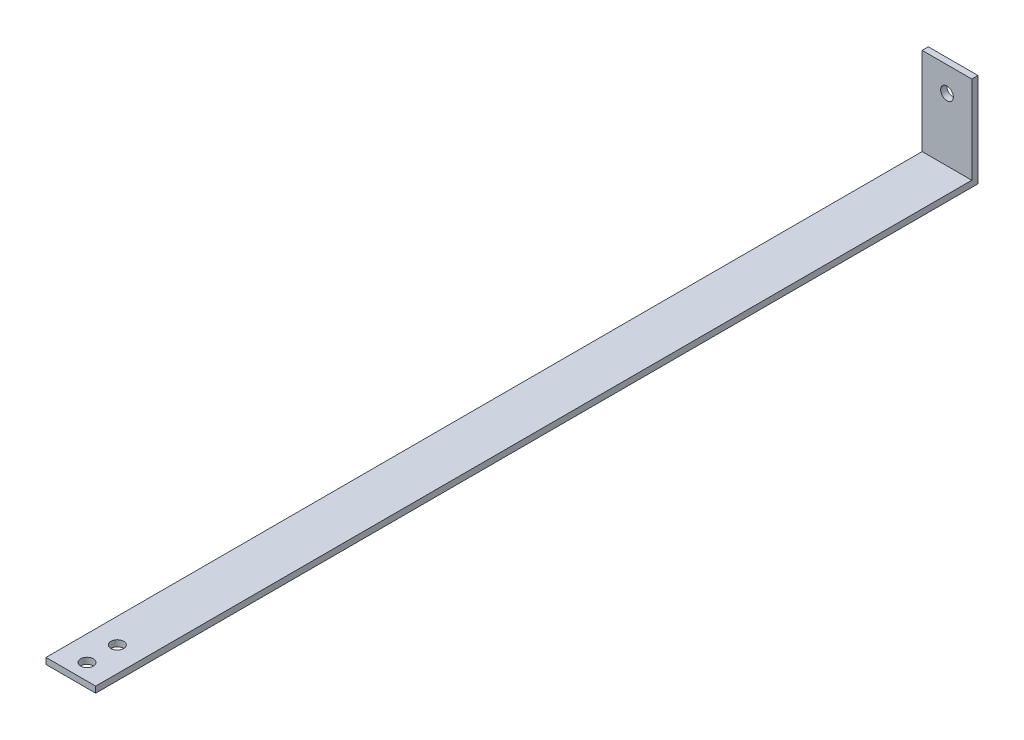
ISO-10303-21;
HEADER;
FILE_DESCRIPTION(('STEP AP214'),'2;1');
FILE_NAME('part.step','',(''),(''),'','','');
FILE_SCHEMA(('AUTOMOTIVE_DESIGN { 1 0 10303 214 1 1 1 1 }'));
ENDSEC;
DATA;
#1=APPLICATION_CONTEXT('core data for automotive mechanical design processes');
#2=APPLICATION_PROTOCOL_DEFINITION('international standard','automotive_design',2000,#1);
#3=PRODUCT_CONTEXT('',#1,'mechanical');
#4=PRODUCT('Part','Part','',(#3));
#5=PRODUCT_RELATED_PRODUCT_CATEGORY('part','',(#4));
#6=PRODUCT_DEFINITION_FORMATION('','',#4);
#7=PRODUCT_DEFINITION_CONTEXT('part definition',#1,'design');
#8=PRODUCT_DEFINITION('design','',#6,#7);
#9=PRODUCT_DEFINITION_SHAPE('','',#8);
#10=(LENGTH_UNIT() NAMED_UNIT(*) SI_UNIT(.MILLI.,.METRE.));
#11=(NAMED_UNIT(*) PLANE_ANGLE_UNIT() SI_UNIT($,.RADIAN.));
#12=(NAMED_UNIT(*) SI_UNIT($,.STERADIAN.) SOLID_ANGLE_UNIT());
#13=UNCERTAINTY_MEASURE_WITH_UNIT(LENGTH_MEASURE(1.E-05),#10,'distance_accuracy_value','');
#14=(GEOMETRIC_REPRESENTATION_CONTEXT(3) GLOBAL_UNCERTAINTY_ASSIGNED_CONTEXT((#13)) GLOBAL_UNIT_ASSIGNED_CONTEXT((#10,
#11,#12)) REPRESENTATION_CONTEXT('',''));
#15=CARTESIAN_POINT('',(0.,0.,0.));
#16=DIRECTION('',(0.,0.,1.));
#17=DIRECTION('',(1.,0.,0.));
#18=AXIS2_PLACEMENT_3D('',#15,#16,#17);
#19=CARTESIAN_POINT('',(50.8,6.3099999999999,6.31000000000004));
#20=DIRECTION('',(0.,0.,-1.));
#21=DIRECTION('',(0.,1.,0.));
#22=AXIS2_PLACEMENT_3D('',#19,#20,#21);
#23=PLANE('',#22);
#24=CARTESIAN_POINT('',(25.4,70.53,6.31000000000003));
#25=DIRECTION('',(0.,0.,-1.));
#26=DIRECTION('',(0.,1.,0.));
#27=AXIS2_PLACEMENT_3D('',#24,#25,#26);
#28=CIRCLE('',#27,6.5);
#29=CARTESIAN_POINT('',(25.4,77.03,6.31000000000003));
#30=VERTEX_POINT('',#29);
#31=EDGE_CURVE('E161',#30,#30,#28,.T.);
#32=ORIENTED_EDGE('',*,*,#31,.T.);
#33=EDGE_LOOP('',(#32));
#34=FACE_BOUND('',#33,.T.);
#35=DIRECTION('',(0.,-1.,0.));
#36=VECTOR('',#35,1.);
#37=CARTESIAN_POINT('',(0.,6.3099999999999,6.31000000000004));
#38=LINE('',#37,#36);
#39=CARTESIAN_POINT('',(0.,95.93,6.31000000000003));
#40=VERTEX_POINT('',#39);
#41=CARTESIAN_POINT('',(0.,6.3099999999999,6.31000000000004));
#42=VERTEX_POINT('',#41);
#43=EDGE_CURVE('E117',#40,#42,#38,.T.);
#44=ORIENTED_EDGE('',*,*,#43,.T.);
#45=DIRECTION('',(-1.,0.,0.));
#46=VECTOR('',#45,1.);
#47=CARTESIAN_POINT('',(50.8,6.3099999999999,6.31000000000004));
#48=LINE('',#47,#46);
#49=CARTESIAN_POINT('',(50.8,6.3099999999999,6.31000000000004));
#50=VERTEX_POINT('',#49);
#51=EDGE_CURVE('E11',#50,#42,#48,.T.);
#52=ORIENTED_EDGE('',*,*,#51,.F.);
#53=DIRECTION('',(0.,-1.,0.));
#54=VECTOR('',#53,1.);
#55=CARTESIAN_POINT('',(50.8,6.3099999999999,6.31000000000004));
#56=LINE('',#55,#54);
#57=CARTESIAN_POINT('',(50.8,95.93,6.31000000000003));
#58=VERTEX_POINT('',#57);
#59=EDGE_CURVE('E128',#58,#50,#56,.T.);
#60=ORIENTED_EDGE('',*,*,#59,.F.);
#61=DIRECTION('',(-1.,0.,0.));
#62=VECTOR('',#61,1.);
#63=CARTESIAN_POINT('',(50.8,95.93,6.31000000000003));
#64=LINE('',#63,#62);
#65=EDGE_CURVE('E113',#58,#40,#64,.T.);
#66=ORIENTED_EDGE('',*,*,#65,.T.);
#67=EDGE_LOOP('',(#44,#52,#60,#66));
#68=FACE_BOUND('',#67,.T.);
#69=ADVANCED_FACE('F33',(#34,#68),#23,.F.);
#70=CARTESIAN_POINT('',(50.8,6.30999999999989,902.2));
#71=DIRECTION('',(0.,-1.,0.));
#72=DIRECTION('',(0.,0.,-1.));
#73=AXIS2_PLACEMENT_3D('',#70,#71,#72);
#74=PLANE('',#73);
#75=CARTESIAN_POINT('',(25.4000000000054,6.30999999999989,854.699999999994));
#76=DIRECTION('',(0.,-1.,0.));
#77=DIRECTION('',(0.,0.,-1.));
#78=AXIS2_PLACEMENT_3D('',#75,#76,#77);
#79=CIRCLE('',#78,6.5);
#80=CARTESIAN_POINT('',(25.4000000000054,6.30999999999989,848.199999999994));
#81=VERTEX_POINT('',#80);
#82=EDGE_CURVE('E167',#81,#81,#79,.T.);
#83=ORIENTED_EDGE('',*,*,#82,.T.);
#84=EDGE_LOOP('',(#83));
#85=FACE_BOUND('',#84,.T.);
#86=CARTESIAN_POINT('',(25.4000000000051,6.30999999999989,885.699999999994));
#87=DIRECTION('',(0.,-1.,0.));
#88=DIRECTION('',(0.,0.,-1.));
#89=AXIS2_PLACEMENT_3D('',#86,#87,#88);
#90=CIRCLE('',#89,6.5);
#91=CARTESIAN_POINT('',(25.4000000000051,6.30999999999989,879.199999999994));
#92=VERTEX_POINT('',#91);
#93=EDGE_CURVE('E121',#92,#92,#90,.T.);
#94=ORIENTED_EDGE('',*,*,#93,.T.);
#95=EDGE_LOOP('',(#94));
#96=FACE_BOUND('',#95,.T.);
#97=DIRECTION('',(0.,0.,1.));
#98=VECTOR('',#97,1.);
#99=CARTESIAN_POINT('',(0.,6.30999999999989,902.2));
#100=LINE('',#99,#98);
#101=CARTESIAN_POINT('',(0.,6.30999999999989,902.2));
#102=VERTEX_POINT('',#101);
#103=EDGE_CURVE('E120',#42,#102,#100,.T.);
#104=ORIENTED_EDGE('',*,*,#103,.T.);
#105=DIRECTION('',(-1.,0.,0.));
#106=VECTOR('',#105,1.);
#107=CARTESIAN_POINT('',(50.8,6.30999999999989,902.2));
#108=LINE('',#107,#106);
#109=CARTESIAN_POINT('',(50.8,6.30999999999989,902.2));
#110=VERTEX_POINT('',#109);
#111=EDGE_CURVE('E41',#110,#102,#108,.T.);
#112=ORIENTED_EDGE('',*,*,#111,.F.);
#113=DIRECTION('',(0.,0.,1.));
#114=VECTOR('',#113,1.);
#115=CARTESIAN_POINT('',(50.8,6.30999999999989,902.2));
#116=LINE('',#115,#114);
#117=EDGE_CURVE('E86',#50,#110,#116,.T.);
#118=ORIENTED_EDGE('',*,*,#117,.F.);
#119=ORIENTED_EDGE('',*,*,#51,.T.);
#120=EDGE_LOOP('',(#104,#112,#118,#119));
#121=FACE_BOUND('',#120,.T.);
#122=ADVANCED_FACE('F153',(#85,#96,#121),#74,.F.);
#123=CARTESIAN_POINT('',(50.8,-1.10487634219074E-13,902.2));
#124=DIRECTION('',(0.,0.,-1.));
#125=DIRECTION('',(-1.,0.,0.));
#126=AXIS2_PLACEMENT_3D('',#123,#124,#125);
#127=PLANE('',#126);
#128=DIRECTION('',(0.,-1.,0.));
#129=VECTOR('',#128,1.);
#130=CARTESIAN_POINT('',(0.,-1.10487634219074E-13,902.2));
#131=LINE('',#130,#129);
#132=CARTESIAN_POINT('',(0.,-1.10487634219074E-13,902.2));
#133=VERTEX_POINT('',#132);
#134=EDGE_CURVE('E123',#102,#133,#131,.T.);
#135=ORIENTED_EDGE('',*,*,#134,.T.);
#136=DIRECTION('',(-1.,0.,0.));
#137=VECTOR('',#136,1.);
#138=CARTESIAN_POINT('',(50.8,-1.10487634219074E-13,902.2));
#139=LINE('',#138,#137);
#140=CARTESIAN_POINT('',(50.8,-1.10487634219074E-13,902.2));
#141=VERTEX_POINT('',#140);
#142=EDGE_CURVE('E108',#141,#133,#139,.T.);
#143=ORIENTED_EDGE('',*,*,#142,.F.);
#144=DIRECTION('',(0.,-1.,0.));
#145=VECTOR('',#144,1.);
#146=CARTESIAN_POINT('',(50.8,-1.10487634219074E-13,902.2));
#147=LINE('',#146,#145);
#148=EDGE_CURVE('E99',#110,#141,#147,.T.);
#149=ORIENTED_EDGE('',*,*,#148,.F.);
#150=ORIENTED_EDGE('',*,*,#111,.T.);
#151=EDGE_LOOP('',(#135,#143,#149,#150));
#152=FACE_BOUND('',#151,.T.);
#153=ADVANCED_FACE('F134',(#152),#127,.F.);
#154=CARTESIAN_POINT('',(50.8,0.,0.));
#155=DIRECTION('',(0.,1.,0.));
#156=DIRECTION('',(0.,0.,1.));
#157=AXIS2_PLACEMENT_3D('',#154,#155,#156);
#158=PLANE('',#157);
#159=CARTESIAN_POINT('',(25.4000000000054,-1.04670561923124E-13,854.699999999994));
#160=DIRECTION('',(0.,-1.,0.));
#161=DIRECTION('',(0.,0.,-1.));
#162=AXIS2_PLACEMENT_3D('',#159,#160,#161);
#163=CIRCLE('',#162,6.5);
#164=CARTESIAN_POINT('',(25.4000000000054,-1.03874541503678E-13,848.199999999994));
#165=VERTEX_POINT('',#164);
#166=EDGE_CURVE('E163',#165,#165,#163,.T.);
#167=ORIENTED_EDGE('',*,*,#166,.F.);
#168=EDGE_LOOP('',(#167));
#169=FACE_BOUND('',#168,.T.);
#170=CARTESIAN_POINT('',(25.4000000000051,-1.0846696700048E-13,885.699999999994));
#171=DIRECTION('',(0.,-1.,0.));
#172=DIRECTION('',(0.,0.,-1.));
#173=AXIS2_PLACEMENT_3D('',#170,#171,#172);
#174=CIRCLE('',#173,6.5);
#175=CARTESIAN_POINT('',(25.4000000000051,-1.07670946581035E-13,879.199999999994));
#176=VERTEX_POINT('',#175);
#177=EDGE_CURVE('E174',#176,#176,#174,.T.);
#178=ORIENTED_EDGE('',*,*,#177,.F.);
#179=EDGE_LOOP('',(#178));
#180=FACE_BOUND('',#179,.T.);
#181=DIRECTION('',(0.,0.,-1.));
#182=VECTOR('',#181,1.);
#183=CARTESIAN_POINT('',(0.,0.,0.));
#184=LINE('',#183,#182);
#185=CARTESIAN_POINT('',(0.,0.,0.));
#186=VERTEX_POINT('',#185);
#187=EDGE_CURVE('E107',#133,#186,#184,.T.);
#188=ORIENTED_EDGE('',*,*,#187,.T.);
#189=DIRECTION('',(-1.,0.,0.));
#190=VECTOR('',#189,1.);
#191=CARTESIAN_POINT('',(50.8,0.,0.));
#192=LINE('',#191,#190);
#193=CARTESIAN_POINT('',(50.8,0.,0.));
#194=VERTEX_POINT('',#193);
#195=EDGE_CURVE('E104',#194,#186,#192,.T.);
#196=ORIENTED_EDGE('',*,*,#195,.F.);
#197=DIRECTION('',(0.,0.,-1.));
#198=VECTOR('',#197,1.);
#199=CARTESIAN_POINT('',(50.8,0.,0.));
#200=LINE('',#199,#198);
#201=EDGE_CURVE('E93',#141,#194,#200,.T.);
#202=ORIENTED_EDGE('',*,*,#201,.F.);
#203=ORIENTED_EDGE('',*,*,#142,.T.);
#204=EDGE_LOOP('',(#188,#196,#202,#203));
#205=FACE_BOUND('',#204,.T.);
#206=ADVANCED_FACE('F105',(#169,#180,#205),#158,.F.);
#207=CARTESIAN_POINT('',(50.8,95.93,0.));
#208=DIRECTION('',(0.,0.,1.));
#209=DIRECTION('',(0.,-1.,0.));
#210=AXIS2_PLACEMENT_3D('',#207,#208,#209);
#211=PLANE('',#210);
#212=CARTESIAN_POINT('',(25.4,70.53,0.));
#213=DIRECTION('',(0.,0.,-1.));
#214=DIRECTION('',(0.,1.,0.));
#215=AXIS2_PLACEMENT_3D('',#212,#213,#214);
#216=CIRCLE('',#215,6.5);
#217=CARTESIAN_POINT('',(25.4,77.03,0.));
#218=VERTEX_POINT('',#217);
#219=EDGE_CURVE('E164',#218,#218,#216,.T.);
#220=ORIENTED_EDGE('',*,*,#219,.F.);
#221=EDGE_LOOP('',(#220));
#222=FACE_BOUND('',#221,.T.);
#223=DIRECTION('',(0.,1.,0.));
#224=VECTOR('',#223,1.);
#225=CARTESIAN_POINT('',(0.,95.93,0.));
#226=LINE('',#225,#224);
#227=CARTESIAN_POINT('',(0.,95.93,0.));
#228=VERTEX_POINT('',#227);
#229=EDGE_CURVE('E72',#186,#228,#226,.T.);
#230=ORIENTED_EDGE('',*,*,#229,.T.);
#231=DIRECTION('',(-1.,0.,0.));
#232=VECTOR('',#231,1.);
#233=CARTESIAN_POINT('',(50.8,95.93,0.));
#234=LINE('',#233,#232);
#235=CARTESIAN_POINT('',(50.8,95.93,0.));
#236=VERTEX_POINT('',#235);
#237=EDGE_CURVE('E109',#236,#228,#234,.T.);
#238=ORIENTED_EDGE('',*,*,#237,.F.);
#239=DIRECTION('',(0.,1.,0.));
#240=VECTOR('',#239,1.);
#241=CARTESIAN_POINT('',(50.8,95.93,0.));
#242=LINE('',#241,#240);
#243=EDGE_CURVE('E97',#194,#236,#242,.T.);
#244=ORIENTED_EDGE('',*,*,#243,.F.);
#245=ORIENTED_EDGE('',*,*,#195,.T.);
#246=EDGE_LOOP('',(#230,#238,#244,#245));
#247=FACE_BOUND('',#246,.T.);
#248=ADVANCED_FACE('F111',(#222,#247),#211,.F.);
#249=CARTESIAN_POINT('',(50.8,95.93,6.31000000000003));
#250=DIRECTION('',(0.,-1.,0.));
#251=DIRECTION('',(0.,0.,-1.));
#252=AXIS2_PLACEMENT_3D('',#249,#250,#251);
#253=PLANE('',#252);
#254=DIRECTION('',(0.,0.,1.));
#255=VECTOR('',#254,1.);
#256=CARTESIAN_POINT('',(0.,95.93,6.31000000000003));
#257=LINE('',#256,#255);
#258=EDGE_CURVE('E78',#228,#40,#257,.T.);
#259=ORIENTED_EDGE('',*,*,#258,.T.);
#260=ORIENTED_EDGE('',*,*,#65,.F.);
#261=DIRECTION('',(0.,0.,1.));
#262=VECTOR('',#261,1.);
#263=CARTESIAN_POINT('',(50.8,95.93,6.31000000000003));
#264=LINE('',#263,#262);
#265=EDGE_CURVE('E49',#236,#58,#264,.T.);
#266=ORIENTED_EDGE('',*,*,#265,.F.);
#267=ORIENTED_EDGE('',*,*,#237,.T.);
#268=EDGE_LOOP('',(#259,#260,#266,#267));
#269=FACE_BOUND('',#268,.T.);
#270=ADVANCED_FACE('F141',(#269),#253,.F.);
#271=CARTESIAN_POINT('',(50.8,0.,0.));
#272=DIRECTION('',(-1.,0.,0.));
#273=DIRECTION('',(0.,0.,1.));
#274=AXIS2_PLACEMENT_3D('',#271,#272,#273);
#275=PLANE('',#274);
#276=ORIENTED_EDGE('',*,*,#59,.T.);
#277=ORIENTED_EDGE('',*,*,#117,.T.);
#278=ORIENTED_EDGE('',*,*,#148,.T.);
#279=ORIENTED_EDGE('',*,*,#201,.T.);
#280=ORIENTED_EDGE('',*,*,#243,.T.);
#281=ORIENTED_EDGE('',*,*,#265,.T.);
#282=EDGE_LOOP('',(#276,#277,#278,#279,#280,#281));
#283=FACE_BOUND('',#282,.T.);
#284=ADVANCED_FACE('F95',(#283),#275,.F.);
#285=CARTESIAN_POINT('',(0.,0.,0.));
#286=DIRECTION('',(-1.,0.,0.));
#287=DIRECTION('',(0.,0.,1.));
#288=AXIS2_PLACEMENT_3D('',#285,#286,#287);
#289=PLANE('',#288);
#290=ORIENTED_EDGE('',*,*,#43,.F.);
#291=ORIENTED_EDGE('',*,*,#258,.F.);
#292=ORIENTED_EDGE('',*,*,#229,.F.);
#293=ORIENTED_EDGE('',*,*,#187,.F.);
#294=ORIENTED_EDGE('',*,*,#134,.F.);
#295=ORIENTED_EDGE('',*,*,#103,.F.);
#296=EDGE_LOOP('',(#290,#291,#292,#293,#294,#295));
#297=FACE_BOUND('',#296,.T.);
#298=ADVANCED_FACE('F137',(#297),#289,.T.);
#299=CARTESIAN_POINT('',(25.4000000000051,9.99999999999989,885.699999999994));
#300=DIRECTION('',(0.,-1.,0.));
#301=DIRECTION('',(0.,0.,-1.));
#302=AXIS2_PLACEMENT_3D('',#299,#300,#301);
#303=CYLINDRICAL_SURFACE('',#302,6.5);
#304=ORIENTED_EDGE('',*,*,#177,.T.);
#305=EDGE_LOOP('',(#304));
#306=FACE_BOUND('',#305,.T.);
#307=ORIENTED_EDGE('',*,*,#93,.F.);
#308=EDGE_LOOP('',(#307));
#309=FACE_BOUND('',#308,.T.);
#310=ADVANCED_FACE('F183',(#306,#309),#303,.F.);
#311=CARTESIAN_POINT('',(25.4000000000054,9.9999999999999,854.699999999994));
#312=DIRECTION('',(0.,-1.,0.));
#313=DIRECTION('',(0.,0.,-1.));
#314=AXIS2_PLACEMENT_3D('',#311,#312,#313);
#315=CYLINDRICAL_SURFACE('',#314,6.5);
#316=ORIENTED_EDGE('',*,*,#166,.T.);
#317=EDGE_LOOP('',(#316));
#318=FACE_BOUND('',#317,.T.);
#319=ORIENTED_EDGE('',*,*,#82,.F.);
#320=EDGE_LOOP('',(#319));
#321=FACE_BOUND('',#320,.T.);
#322=ADVANCED_FACE('F185',(#318,#321),#315,.F.);
#323=CARTESIAN_POINT('',(25.4,70.53,10.));
#324=DIRECTION('',(0.,0.,-1.));
#325=DIRECTION('',(0.,1.,0.));
#326=AXIS2_PLACEMENT_3D('',#323,#324,#325);
#327=CYLINDRICAL_SURFACE('',#326,6.5);
#328=ORIENTED_EDGE('',*,*,#219,.T.);
#329=EDGE_LOOP('',(#328));
#330=FACE_BOUND('',#329,.T.);
#331=ORIENTED_EDGE('',*,*,#31,.F.);
#332=EDGE_LOOP('',(#331));
#333=FACE_BOUND('',#332,.T.);
#334=ADVANCED_FACE('F192',(#330,#333),#327,.F.);
#335=CLOSED_SHELL('',(#69,#122,#153,#206,#248,#270,#284,#298,#310,#322,#334));
#336=MANIFOLD_SOLID_BREP('B2',#335);
#337=ADVANCED_BREP_SHAPE_REPRESENTATION('',(#18,#336),#14);
#338=SHAPE_DEFINITION_REPRESENTATION(#9,#337);
ENDSEC;
END-ISO-10303-21;
